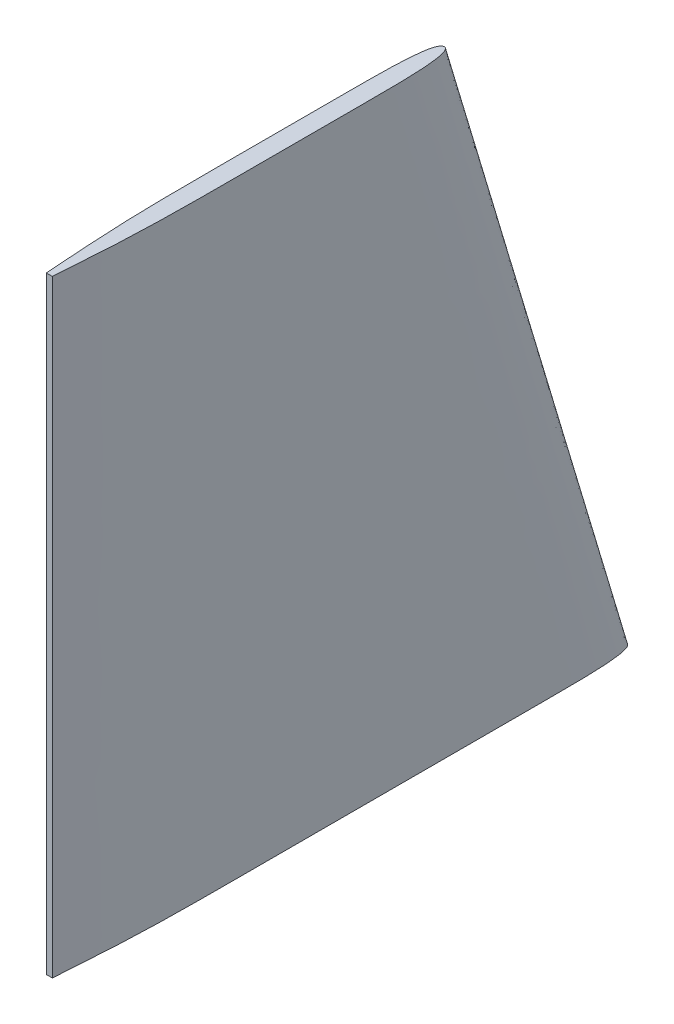
ISO-10303-21;
HEADER;
FILE_DESCRIPTION(('STEP AP214'),'2;1');
FILE_NAME('part.step','',(''),(''),'','','');
FILE_SCHEMA(('AUTOMOTIVE_DESIGN { 1 0 10303 214 1 1 1 1 }'));
ENDSEC;
DATA;
#1=APPLICATION_CONTEXT('core data for automotive mechanical design processes');
#2=APPLICATION_PROTOCOL_DEFINITION('international standard','automotive_design',2000,#1);
#3=PRODUCT_CONTEXT('',#1,'mechanical');
#4=PRODUCT('Part','Part','',(#3));
#5=PRODUCT_RELATED_PRODUCT_CATEGORY('part','',(#4));
#6=PRODUCT_DEFINITION_FORMATION('','',#4);
#7=PRODUCT_DEFINITION_CONTEXT('part definition',#1,'design');
#8=PRODUCT_DEFINITION('design','',#6,#7);
#9=PRODUCT_DEFINITION_SHAPE('','',#8);
#10=(LENGTH_UNIT() NAMED_UNIT(*) SI_UNIT(.MILLI.,.METRE.));
#11=(NAMED_UNIT(*) PLANE_ANGLE_UNIT() SI_UNIT($,.RADIAN.));
#12=(NAMED_UNIT(*) SI_UNIT($,.STERADIAN.) SOLID_ANGLE_UNIT());
#13=UNCERTAINTY_MEASURE_WITH_UNIT(LENGTH_MEASURE(1.E-05),#10,'distance_accuracy_value','');
#14=(GEOMETRIC_REPRESENTATION_CONTEXT(3) GLOBAL_UNCERTAINTY_ASSIGNED_CONTEXT((#13)) GLOBAL_UNIT_ASSIGNED_CONTEXT((#10,
#11,#12)) REPRESENTATION_CONTEXT('',''));
#15=CARTESIAN_POINT('',(0.,0.,0.));
#16=DIRECTION('',(0.,0.,1.));
#17=DIRECTION('',(1.,0.,0.));
#18=AXIS2_PLACEMENT_3D('',#15,#16,#17);
#19=CARTESIAN_POINT('',(-2.62500000000001,200.,69.375));
#20=DIRECTION('',(0.,-1.,0.));
#21=DIRECTION('',(0.,0.,-1.));
#22=AXIS2_PLACEMENT_3D('',#19,#20,#21);
#23=PLANE('',#22);
#24=CARTESIAN_POINT('',(0.,200.,60.));
#25=CARTESIAN_POINT('',(-3.,200.,60.));
#26=CARTESIAN_POINT('',(-3.00000000000001,200.,75.));
#27=CARTESIAN_POINT('',(-3.00000000000002,200.,90.));
#28=B_SPLINE_CURVE_WITH_KNOTS('',3,(#24,#25,#26,#27),.UNSPECIFIED.,.F.,.F.,(4,4),(0.,1.),.UNSPECIFIED.);
#29=CARTESIAN_POINT('',(0.,200.,60.));
#30=VERTEX_POINT('',#29);
#31=CARTESIAN_POINT('',(-3.00000000000003,200.,89.9999999999786));
#32=VERTEX_POINT('',#31);
#33=EDGE_CURVE('E211',#30,#32,#28,.T.);
#34=ORIENTED_EDGE('',*,*,#33,.T.);
#35=DIRECTION('',(0.,0.,1.));
#36=VECTOR('',#35,1.);
#37=CARTESIAN_POINT('',(-3.00000000000002,200.,130.));
#38=LINE('',#37,#36);
#39=CARTESIAN_POINT('',(-3.00000000000001,200.,130.));
#40=VERTEX_POINT('',#39);
#41=EDGE_CURVE('E258',#32,#40,#38,.T.);
#42=ORIENTED_EDGE('',*,*,#41,.T.);
#43=CARTESIAN_POINT('',(-3.00000000000001,200.,130.));
#44=CARTESIAN_POINT('',(-3.00000000000001,200.,141.876332104812));
#45=CARTESIAN_POINT('',(-3.00000000000001,200.,161.901498577809));
#46=CARTESIAN_POINT('',(-1.57846483459136,200.,181.873002511274));
#47=CARTESIAN_POINT('',(-1.,200.,190.));
#48=B_SPLINE_CURVE_WITH_KNOTS('',3,(#43,#44,#45,#46,#47),.UNSPECIFIED.,.F.,.F.,(4,1,4),(0.,
0.593070330817264,1.),.UNSPECIFIED.);
#49=CARTESIAN_POINT('',(-1.,200.,190.));
#50=VERTEX_POINT('',#49);
#51=EDGE_CURVE('E266',#40,#50,#48,.T.);
#52=ORIENTED_EDGE('',*,*,#51,.T.);
#53=DIRECTION('',(1.,0.,0.));
#54=VECTOR('',#53,1.);
#55=CARTESIAN_POINT('',(-1.,200.,190.));
#56=LINE('',#55,#54);
#57=CARTESIAN_POINT('',(1.,200.,190.));
#58=VERTEX_POINT('',#57);
#59=EDGE_CURVE('E270',#50,#58,#56,.T.);
#60=ORIENTED_EDGE('',*,*,#59,.T.);
#61=CARTESIAN_POINT('',(1.,200.,190.));
#62=CARTESIAN_POINT('',(1.57846483459136,200.,181.873002511274));
#63=CARTESIAN_POINT('',(3.,200.,161.901498577809));
#64=CARTESIAN_POINT('',(3.,200.,141.876332104812));
#65=CARTESIAN_POINT('',(3.,200.,130.));
#66=B_SPLINE_CURVE_WITH_KNOTS('',3,(#61,#62,#63,#64,#65),.UNSPECIFIED.,.F.,.F.,(4,1,4),(0.,
0.406929669182736,1.),.UNSPECIFIED.);
#67=CARTESIAN_POINT('',(3.,200.,129.99999999915));
#68=VERTEX_POINT('',#67);
#69=EDGE_CURVE('E219',#58,#68,#66,.T.);
#70=ORIENTED_EDGE('',*,*,#69,.T.);
#71=DIRECTION('',(0.,0.,-1.));
#72=VECTOR('',#71,1.);
#73=CARTESIAN_POINT('',(3.,200.,130.));
#74=LINE('',#73,#72);
#75=CARTESIAN_POINT('',(3.,200.,90.));
#76=VERTEX_POINT('',#75);
#77=EDGE_CURVE('E208',#68,#76,#74,.T.);
#78=ORIENTED_EDGE('',*,*,#77,.T.);
#79=CARTESIAN_POINT('',(3.,200.,90.));
#80=CARTESIAN_POINT('',(3.,200.,75.));
#81=CARTESIAN_POINT('',(3.,200.,60.));
#82=CARTESIAN_POINT('',(0.,200.,60.));
#83=B_SPLINE_CURVE_WITH_KNOTS('',3,(#79,#80,#81,#82),.UNSPECIFIED.,.F.,.F.,(4,4),(0.,1.),.UNSPECIFIED.);
#84=EDGE_CURVE('E201',#76,#30,#83,.T.);
#85=ORIENTED_EDGE('',*,*,#84,.T.);
#86=EDGE_LOOP('',(#34,#42,#52,#60,#70,#78,#85));
#87=FACE_BOUND('',#86,.T.);
#88=ADVANCED_FACE('F153',(#87),#23,.F.);
#89=CARTESIAN_POINT('',(-2.625,0.,9.375));
#90=DIRECTION('',(0.,-1.,0.));
#91=DIRECTION('',(0.,0.,-1.));
#92=AXIS2_PLACEMENT_3D('',#89,#90,#91);
#93=PLANE('',#92);
#94=CARTESIAN_POINT('',(0.,0.,0.));
#95=CARTESIAN_POINT('',(-3.,0.,0.));
#96=CARTESIAN_POINT('',(-3.,0.,15.));
#97=CARTESIAN_POINT('',(-3.,0.,30.));
#98=B_SPLINE_CURVE_WITH_KNOTS('',3,(#94,#95,#96,#97),.UNSPECIFIED.,.F.,.F.,(4,4),(0.,1.),.UNSPECIFIED.);
#99=CARTESIAN_POINT('',(0.,0.,0.));
#100=VERTEX_POINT('',#99);
#101=CARTESIAN_POINT('',(-2.99999999999999,0.,30.));
#102=VERTEX_POINT('',#101);
#103=EDGE_CURVE('E307',#100,#102,#98,.T.);
#104=ORIENTED_EDGE('',*,*,#103,.F.);
#105=CARTESIAN_POINT('',(3.,0.,30.));
#106=CARTESIAN_POINT('',(3.,0.,15.));
#107=CARTESIAN_POINT('',(3.,0.,0.));
#108=CARTESIAN_POINT('',(0.,0.,0.));
#109=B_SPLINE_CURVE_WITH_KNOTS('',3,(#105,#106,#107,#108),.UNSPECIFIED.,.F.,.F.,(4,4),(0.,1.),.UNSPECIFIED.);
#110=CARTESIAN_POINT('',(3.,0.,30.));
#111=VERTEX_POINT('',#110);
#112=EDGE_CURVE('E12',#111,#100,#109,.T.);
#113=ORIENTED_EDGE('',*,*,#112,.F.);
#114=DIRECTION('',(0.,0.,-1.));
#115=VECTOR('',#114,1.);
#116=CARTESIAN_POINT('',(3.,0.,130.));
#117=LINE('',#116,#115);
#118=CARTESIAN_POINT('',(3.,0.,130.));
#119=VERTEX_POINT('',#118);
#120=EDGE_CURVE('E164',#119,#111,#117,.T.);
#121=ORIENTED_EDGE('',*,*,#120,.F.);
#122=CARTESIAN_POINT('',(1.,0.,190.));
#123=CARTESIAN_POINT('',(1.57846483459136,0.,181.873002511274));
#124=CARTESIAN_POINT('',(3.,0.,161.901498577809));
#125=CARTESIAN_POINT('',(3.,0.,141.876332104812));
#126=CARTESIAN_POINT('',(3.,0.,130.));
#127=B_SPLINE_CURVE_WITH_KNOTS('',3,(#122,#123,#124,#125,#126),.UNSPECIFIED.,.F.,.F.,(4,1,4),
(0.,0.406929669182736,1.),.UNSPECIFIED.);
#128=CARTESIAN_POINT('',(1.,0.,190.));
#129=VERTEX_POINT('',#128);
#130=EDGE_CURVE('E437',#129,#119,#127,.T.);
#131=ORIENTED_EDGE('',*,*,#130,.F.);
#132=DIRECTION('',(1.,0.,0.));
#133=VECTOR('',#132,1.);
#134=CARTESIAN_POINT('',(1.,0.,190.));
#135=LINE('',#134,#133);
#136=CARTESIAN_POINT('',(-1.,0.,190.));
#137=VERTEX_POINT('',#136);
#138=EDGE_CURVE('E441',#137,#129,#135,.T.);
#139=ORIENTED_EDGE('',*,*,#138,.F.);
#140=CARTESIAN_POINT('',(-3.,0.,130.));
#141=CARTESIAN_POINT('',(-3.,0.,141.876332104812));
#142=CARTESIAN_POINT('',(-3.,0.,161.901498577809));
#143=CARTESIAN_POINT('',(-1.57846483459136,0.,181.873002511274));
#144=CARTESIAN_POINT('',(-1.,0.,190.));
#145=B_SPLINE_CURVE_WITH_KNOTS('',3,(#140,#141,#142,#143,#144),.UNSPECIFIED.,.F.,.F.,(4,1,4),
(0.,0.593070330817264,1.),.UNSPECIFIED.);
#146=CARTESIAN_POINT('',(-3.,0.,130.));
#147=VERTEX_POINT('',#146);
#148=EDGE_CURVE('E318',#147,#137,#145,.T.);
#149=ORIENTED_EDGE('',*,*,#148,.F.);
#150=DIRECTION('',(0.,0.,1.));
#151=VECTOR('',#150,1.);
#152=CARTESIAN_POINT('',(-3.,0.,130.));
#153=LINE('',#152,#151);
#154=EDGE_CURVE('E173',#102,#147,#153,.T.);
#155=ORIENTED_EDGE('',*,*,#154,.F.);
#156=EDGE_LOOP('',(#104,#113,#121,#131,#139,#149,#155));
#157=FACE_BOUND('',#156,.T.);
#158=ADVANCED_FACE('F334',(#157),#93,.T.);
#159=CARTESIAN_POINT('',(-3.,0.,130.));
#160=CARTESIAN_POINT('',(-3.00000000000001,200.,130.));
#161=CARTESIAN_POINT('',(-3.,0.,141.876332104812));
#162=CARTESIAN_POINT('',(-3.00000000000001,200.,141.876332104812));
#163=CARTESIAN_POINT('',(-3.,0.,161.901498577809));
#164=CARTESIAN_POINT('',(-3.00000000000001,200.,161.901498577809));
#165=CARTESIAN_POINT('',(-1.57846483459136,0.,181.873002511274));
#166=CARTESIAN_POINT('',(-1.57846483459136,200.,181.873002511274));
#167=CARTESIAN_POINT('',(-1.,0.,190.));
#168=CARTESIAN_POINT('',(-1.,200.,190.));
#169=B_SPLINE_SURFACE_WITH_KNOTS('',3,1,((#159,#160),(#161,#162),(#163,#164),(#165,#166),(#167,
#168)),.UNSPECIFIED.,.F.,.F.,.F.,(4,1,4),(2,2),(0.,0.593070330817264,1.),(0.,1.),.UNSPECIFIED.);
#170=DIRECTION('',(0.,1.,0.));
#171=VECTOR('',#170,1.);
#172=CARTESIAN_POINT('',(-1.,100.,190.));
#173=LINE('',#172,#171);
#174=EDGE_CURVE('E301',#137,#50,#173,.T.);
#175=DIRECTION('',(0.,-1.,0.));
#176=VECTOR('',#175,1.);
#177=CARTESIAN_POINT('',(-3.00000000000001,100.,130.));
#178=LINE('',#177,#176);
#179=EDGE_CURVE('E299',#40,#147,#178,.T.);
#180=ORIENTED_EDGE('',*,*,#148,.T.);
#181=ORIENTED_EDGE('',*,*,#174,.T.);
#182=ORIENTED_EDGE('',*,*,#51,.F.);
#183=ORIENTED_EDGE('',*,*,#179,.T.);
#184=EDGE_LOOP('',(#180,#181,#182,#183));
#185=FACE_BOUND('',#184,.T.);
#186=ADVANCED_FACE('F298',(#185),#169,.T.);
#187=CARTESIAN_POINT('',(-1.,0.,190.));
#188=DIRECTION('',(0.,0.,1.));
#189=DIRECTION('',(1.,0.,0.));
#190=AXIS2_PLACEMENT_3D('',#187,#188,#189);
#191=PLANE('',#190);
#192=ORIENTED_EDGE('',*,*,#138,.T.);
#193=DIRECTION('',(0.,1.,0.));
#194=VECTOR('',#193,1.);
#195=CARTESIAN_POINT('',(1.,100.,190.));
#196=LINE('',#195,#194);
#197=EDGE_CURVE('E213',#129,#58,#196,.T.);
#198=ORIENTED_EDGE('',*,*,#197,.T.);
#199=ORIENTED_EDGE('',*,*,#59,.F.);
#200=ORIENTED_EDGE('',*,*,#174,.F.);
#201=EDGE_LOOP('',(#192,#198,#199,#200));
#202=FACE_BOUND('',#201,.T.);
#203=ADVANCED_FACE('F333',(#202),#191,.T.);
#204=CARTESIAN_POINT('',(1.,0.,190.));
#205=CARTESIAN_POINT('',(1.,200.,190.));
#206=CARTESIAN_POINT('',(1.22839991619947,0.,186.79115231492));
#207=CARTESIAN_POINT('',(1.1427784769092,200.,187.994069381754));
#208=CARTESIAN_POINT('',(1.62559832493885,0.,181.187198564355));
#209=CARTESIAN_POINT('',(1.44625597384478,200.,183.744062283602));
#210=CARTESIAN_POINT('',(2.10133270366026,0.,173.728203933576));
#211=CARTESIAN_POINT('',(1.92836634882991,200.,176.558624744388));
#212=CARTESIAN_POINT('',(2.46724921451769,0.,166.777851717718));
#213=CARTESIAN_POINT('',(2.39122824889401,200.,168.567500768339));
#214=CARTESIAN_POINT('',(2.71584131170887,0.,160.024483906076));
#215=CARTESIAN_POINT('',(2.72680834161663,200.,160.02470008989));
#216=CARTESIAN_POINT('',(2.87243595549171,0.,153.268388419225));
#217=CARTESIAN_POINT('',(2.90597455512541,200.,151.477144964404));
#218=CARTESIAN_POINT('',(2.96139997505181,0.,146.309871219871));
#219=CARTESIAN_POINT('',(2.98184822912165,200.,143.473656526323));
#220=CARTESIAN_POINT('',(2.99871561952475,0.,138.834538611101));
#221=CARTESIAN_POINT('',(3.00008513045306,200.,136.271701034534));
#222=CARTESIAN_POINT('',(3.,0.,133.216965959994));
#223=CARTESIAN_POINT('',(3.,200.,132.011005554116));
#224=CARTESIAN_POINT('',(3.,0.,123.096155885579));
#225=CARTESIAN_POINT('',(3.,200.,125.684235073823));
#226=CARTESIAN_POINT('',(3.00000000000001,0.,107.985574633679));
#227=CARTESIAN_POINT('',(3.,200.,118.883473478397));
#228=CARTESIAN_POINT('',(2.99999999999999,0.,81.2042234567904));
#229=CARTESIAN_POINT('',(3.,200.,109.690937776367));
#230=CARTESIAN_POINT('',(3.00000000000001,0.,53.5240727439339));
#231=CARTESIAN_POINT('',(3.,200.,100.626439383699));
#232=CARTESIAN_POINT('',(3.,0.,37.3749922163502));
#233=CARTESIAN_POINT('',(3.,200.,93.9919634073409));
#234=CARTESIAN_POINT('',(3.,0.,28.237552894422));
#235=CARTESIAN_POINT('',(3.,200.,89.0460160300585));
#236=CARTESIAN_POINT('',(2.99957049518228,0.,25.9097026791504));
#237=CARTESIAN_POINT('',(3.00006616512228,200.,87.5467787003998));
#238=CARTESIAN_POINT('',(2.98988011125207,0.,23.0774403594428));
#239=CARTESIAN_POINT('',(2.99718011565547,200.,85.3915134223857));
#240=CARTESIAN_POINT('',(2.97679635760748,0.,21.0622347910332));
#241=CARTESIAN_POINT('',(2.99223385049097,200.,83.6928252148822));
#242=CARTESIAN_POINT('',(2.95663952798895,0.,19.129242581705));
#243=CARTESIAN_POINT('',(2.98296098657233,199.999999999999,81.9088343036633));
#244=CARTESIAN_POINT('',(2.9275753141456,0.,17.2521309732259));
#245=CARTESIAN_POINT('',(2.96716368827388,200.,80.0386696026332));
#246=CARTESIAN_POINT('',(2.8878489889125,0.,15.4217779527435));
#247=CARTESIAN_POINT('',(2.94198326759628,200.,78.0844908992591));
#248=CARTESIAN_POINT('',(2.8348455301887,0.,13.6221574441033));
#249=CARTESIAN_POINT('',(2.90359749960995,200.,76.0528020037848));
#250=CARTESIAN_POINT('',(2.76523236207934,0.,11.8449743073342));
#251=CARTESIAN_POINT('',(2.84696200460668,200.,73.9553561153098));
#252=CARTESIAN_POINT('',(2.67427663443803,0.,10.0801797024621));
#253=CARTESIAN_POINT('',(2.76544368361298,200.,71.8096913873995));
#254=CARTESIAN_POINT('',(2.55492098315339,0.,8.32021005001306));
#255=CARTESIAN_POINT('',(2.64997678268524,200.,69.6384999151848));
#256=CARTESIAN_POINT('',(2.42273030936036,0.,6.85127209066607));
#257=CARTESIAN_POINT('',(2.51488348519361,200.,67.8300214375382));
#258=CARTESIAN_POINT('',(2.28774392157075,0.,5.67179053958263));
#259=CARTESIAN_POINT('',(2.37325514163534,200.,66.3977793323809));
#260=CARTESIAN_POINT('',(2.16755580650791,0.,4.7847496694823));
#261=CARTESIAN_POINT('',(2.24582248081069,200.,65.3348221636608));
#262=CARTESIAN_POINT('',(2.02323044816473,0.,3.89479622129176));
#263=CARTESIAN_POINT('',(2.09201576963375,200.,64.2864831554632));
#264=CARTESIAN_POINT('',(1.84506587076574,0.,3.00387857423256));
#265=CARTESIAN_POINT('',(1.90213809956185,200.,63.258613611815));
#266=CARTESIAN_POINT('',(1.61929260663474,0.,2.11341224461592));
#267=CARTESIAN_POINT('',(1.66264930883675,200.,62.2561846664801));
#268=CARTESIAN_POINT('',(1.31476553540295,0.,1.236615974021));
#269=CARTESIAN_POINT('',(1.34278620710897,200.,61.2958080930353));
#270=CARTESIAN_POINT('',(0.944668805293048,0.,0.538733476524419));
#271=CARTESIAN_POINT('',(0.959029472152529,200.,60.5549729497324));
#272=CARTESIAN_POINT('',(0.477881991876329,0.,0.0944126687504375));
#273=CARTESIAN_POINT('',(0.481356289171885,200.,60.0948315206508));
#274=CARTESIAN_POINT('',(0.160411232315125,0.,0.));
#275=CARTESIAN_POINT('',(0.160411232315125,200.,60.));
#276=CARTESIAN_POINT('',(-0.160411232821727,0.,0.));
#277=CARTESIAN_POINT('',(-0.160411232821718,200.,60.));
#278=CARTESIAN_POINT('',(-0.477881988808176,0.,0.0944126874889169));
#279=CARTESIAN_POINT('',(-0.481356294911899,200.,60.0948315211697));
#280=CARTESIAN_POINT('',(-0.94466879342443,0.,0.538733423072363));
#281=CARTESIAN_POINT('',(-0.959029497747062,200.,60.5549729789543));
#282=CARTESIAN_POINT('',(-1.31476551641491,0.,1.23661601254728));
#283=CARTESIAN_POINT('',(-1.34278625860613,200.,61.2958082018318));
#284=CARTESIAN_POINT('',(-1.61929257271495,0.,2.11341200632953));
#285=CARTESIAN_POINT('',(-1.66264938966322,200.,62.2561849407632));
#286=CARTESIAN_POINT('',(-1.84506583617126,0.,3.00387863170314));
#287=CARTESIAN_POINT('',(-1.90213820966377,200.,63.258614113687));
#288=CARTESIAN_POINT('',(-2.02323039134164,0.,3.89479552522899));
#289=CARTESIAN_POINT('',(-2.09201590131631,200.,64.2864839510288));
#290=CARTESIAN_POINT('',(-2.16755577564738,0.,4.78475030503517));
#291=CARTESIAN_POINT('',(-2.24582263792644,200.,65.3348232962497));
#292=CARTESIAN_POINT('',(-2.28774382666653,0.,5.67178840522121));
#293=CARTESIAN_POINT('',(-2.37325530300576,200.,66.3977808667362));
#294=CARTESIAN_POINT('',(-2.42273032179551,0.,6.85127481033415));
#295=CARTESIAN_POINT('',(-2.51488368072928,200.,67.8300235069869));
#296=CARTESIAN_POINT('',(-2.55492074926947,0.,8.32020165292678));
#297=CARTESIAN_POINT('',(-2.64997693740049,200.,69.6385027899385));
#298=CARTESIAN_POINT('',(-2.67427686278496,0.,10.0801917160405));
#299=CARTESIAN_POINT('',(-2.76544390802213,200.,71.809695016281));
#300=CARTESIAN_POINT('',(-2.76523176086813,0.,11.8449487475952));
#301=CARTESIAN_POINT('',(-2.84696204743423,200.,73.9553606385959));
#302=CARTESIAN_POINT('',(-2.83484650221972,0.,13.6222018056486));
#303=CARTESIAN_POINT('',(-2.90359777720128,200.,76.0528066538513));
#304=CARTESIAN_POINT('',(-2.88784698460734,0.,15.4216884781874));
#305=CARTESIAN_POINT('',(-2.94198301021522,200.,78.084496348139));
#306=CARTESIAN_POINT('',(-2.92757914528281,0.,17.2523020293564));
#307=CARTESIAN_POINT('',(-2.96716437742186,200.,80.0386737200484));
#308=CARTESIAN_POINT('',(-2.9566329069814,0.,19.1289466738039));
#309=CARTESIAN_POINT('',(-2.9829599279722,200.,81.9088401816736));
#310=CARTESIAN_POINT('',(-2.97680351518832,0.,21.0625435512961));
#311=CARTESIAN_POINT('',(-2.99223546065177,200.,83.6928271496568));
#312=CARTESIAN_POINT('',(-2.98988038209552,0.,23.0774816973876));
#313=CARTESIAN_POINT('',(-2.99717943797594,200.,85.3915172020501));
#314=CARTESIAN_POINT('',(-2.99955778376465,0.,25.9092058030223));
#315=CARTESIAN_POINT('',(-3.00006658190649,200.,87.5467801774987));
#316=CARTESIAN_POINT('',(-3.,0.,28.237551778753));
#317=CARTESIAN_POINT('',(-3.00000000000002,200.,89.0460167899758));
#318=CARTESIAN_POINT('',(-2.99999999999999,0.,37.3749968615965));
#319=CARTESIAN_POINT('',(-3.00000000000002,200.,93.9919602148462));
#320=CARTESIAN_POINT('',(-2.99999999999999,0.,53.5240853669206));
#321=CARTESIAN_POINT('',(-3.00000000000002,200.,100.626435508985));
#322=CARTESIAN_POINT('',(-3.,0.,81.2042341568639));
#323=CARTESIAN_POINT('',(-3.00000000000002,200.,109.690934469865));
#324=CARTESIAN_POINT('',(-3.,0.,107.985576291092));
#325=CARTESIAN_POINT('',(-3.00000000000002,200.,118.883471989499));
#326=CARTESIAN_POINT('',(-3.,0.,123.09615588558));
#327=CARTESIAN_POINT('',(-3.00000000000002,200.,125.684235073823));
#328=CARTESIAN_POINT('',(-3.,0.,130.));
#329=CARTESIAN_POINT('',(-3.00000000000002,200.,130.));
#330=B_SPLINE_SURFACE_WITH_KNOTS('',3,1,((#204,#205),(#206,#207),(#208,#209),(#210,#211),(#212,
#213),(#214,#215),(#216,#217),(#218,#219),(#220,#221),(#222,#223),(#224,#225),(#226,#227),(#228,
#229),(#230,#231),(#232,#233),(#234,#235),(#236,#237),(#238,#239),(#240,#241),(#242,#243),(#244,
#245),(#246,#247),(#248,#249),(#250,#251),(#252,#253),(#254,#255),(#256,#257),(#258,#259),(#260,
#261),(#262,#263),(#264,#265),(#266,#267),(#268,#269),(#270,#271),(#272,#273),(#274,#275),(#276,
#277),(#278,#279),(#280,#281),(#282,#283),(#284,#285),(#286,#287),(#288,#289),(#290,#291),(#292,
#293),(#294,#295),(#296,#297),(#298,#299),(#300,#301),(#302,#303),(#304,#305),(#306,#307),(#308,
#309),(#310,#311),(#312,#313),(#314,#315),(#316,#317),(#318,#319),(#320,#321),(#322,#323),(#324,
#325),(#326,#327),(#328,#329)),.UNSPECIFIED.,.F.,.F.,.F.,(4,1,1,1,1,1,1,1,2,1,1,1,2,1,1,1,1,1,1,
1,1,1,1,1,1,1,1,1,1,1,1,1,2,1,1,1,1,1,1,1,1,1,1,1,1,1,1,1,1,1,1,1,2,1,1,1,4),(2,2),(0.,
0.0299629532142044,0.0599259064284089,0.0898888596426134,0.119851812856818,0.149814766071022,
0.179777719285227,0.209740672499431,0.239703625713636,0.304006313641028,0.36830900156842,
0.432611689495812,0.496914377423204,0.512281611897376,0.519965229134462,0.527648846371548,
0.535332463608634,0.54301608084572,0.550699698082806,0.558383315319892,0.566066932556978,
0.573750549794064,0.58143416703115,0.589117784268236,0.592959592886779,0.596801401505322,
0.600643210123866,0.604485018742408,0.608326827360952,0.612168635979495,0.616010444598038,
0.617931348907309,0.619852253216581,0.62177314376461,0.623694034312638,0.627535815408696,
0.631377596504754,0.635219377600812,0.63906115869687,0.642902939792928,0.646744720888985,
0.650586501985043,0.658270064177159,0.665953626369275,0.673637188561391,0.681320750753506,
0.689004312945622,0.696687875137738,0.704371437329854,0.712054999521969,0.719738561714085,
0.727422123906201,0.742789248290432,0.807091936217824,0.871394624145216,0.935697312072608,1.),
(0.,1.),.UNSPECIFIED.);
#331=ORIENTED_EDGE('',*,*,#130,.T.);
#332=ORIENTED_EDGE('',*,*,#120,.T.);
#333=ORIENTED_EDGE('',*,*,#112,.T.);
#334=ORIENTED_EDGE('',*,*,#103,.T.);
#335=ORIENTED_EDGE('',*,*,#154,.T.);
#336=ORIENTED_EDGE('',*,*,#179,.F.);
#337=ORIENTED_EDGE('',*,*,#41,.F.);
#338=ORIENTED_EDGE('',*,*,#33,.F.);
#339=ORIENTED_EDGE('',*,*,#84,.F.);
#340=ORIENTED_EDGE('',*,*,#77,.F.);
#341=ORIENTED_EDGE('',*,*,#69,.F.);
#342=ORIENTED_EDGE('',*,*,#197,.F.);
#343=EDGE_LOOP('',(#331,#332,#333,#334,#335,#336,#337,#338,#339,#340,#341,#342));
#344=FACE_BOUND('',#343,.T.);
#345=ADVANCED_FACE('F207',(#344),#330,.T.);
#346=CLOSED_SHELL('',(#88,#158,#186,#203,#345));
#347=MANIFOLD_SOLID_BREP('B2',#346);
#348=ADVANCED_BREP_SHAPE_REPRESENTATION('',(#18,#347),#14);
#349=SHAPE_DEFINITION_REPRESENTATION(#9,#348);
ENDSEC;
END-ISO-10303-21;
